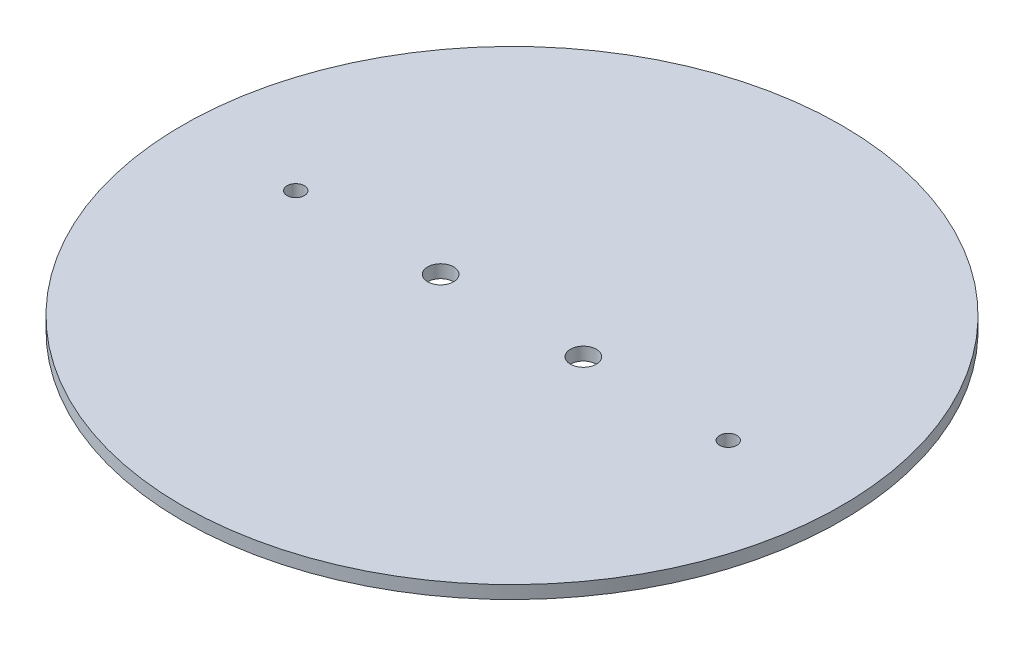
ISO-10303-21;
HEADER;
FILE_DESCRIPTION(('STEP AP214'),'2;1');
FILE_NAME('part.step','',(''),(''),'','','');
FILE_SCHEMA(('AUTOMOTIVE_DESIGN { 1 0 10303 214 1 1 1 1 }'));
ENDSEC;
DATA;
#1=APPLICATION_CONTEXT('core data for automotive mechanical design processes');
#2=APPLICATION_PROTOCOL_DEFINITION('international standard','automotive_design',2000,#1);
#3=PRODUCT_CONTEXT('',#1,'mechanical');
#4=PRODUCT('Part','Part','',(#3));
#5=PRODUCT_RELATED_PRODUCT_CATEGORY('part','',(#4));
#6=PRODUCT_DEFINITION_FORMATION('','',#4);
#7=PRODUCT_DEFINITION_CONTEXT('part definition',#1,'design');
#8=PRODUCT_DEFINITION('design','',#6,#7);
#9=PRODUCT_DEFINITION_SHAPE('','',#8);
#10=(LENGTH_UNIT() NAMED_UNIT(*) SI_UNIT(.MILLI.,.METRE.));
#11=(NAMED_UNIT(*) PLANE_ANGLE_UNIT() SI_UNIT($,.RADIAN.));
#12=(NAMED_UNIT(*) SI_UNIT($,.STERADIAN.) SOLID_ANGLE_UNIT());
#13=UNCERTAINTY_MEASURE_WITH_UNIT(LENGTH_MEASURE(1.E-05),#10,'distance_accuracy_value','');
#14=(GEOMETRIC_REPRESENTATION_CONTEXT(3) GLOBAL_UNCERTAINTY_ASSIGNED_CONTEXT((#13)) GLOBAL_UNIT_ASSIGNED_CONTEXT((#10,
#11,#12)) REPRESENTATION_CONTEXT('',''));
#15=CARTESIAN_POINT('',(0.,0.,0.));
#16=DIRECTION('',(0.,0.,1.));
#17=DIRECTION('',(1.,0.,0.));
#18=AXIS2_PLACEMENT_3D('',#15,#16,#17);
#19=CARTESIAN_POINT('',(0.,-1.5,0.));
#20=DIRECTION('',(0.,1.,0.));
#21=DIRECTION('',(0.,0.,1.));
#22=AXIS2_PLACEMENT_3D('',#19,#20,#21);
#23=CYLINDRICAL_SURFACE('',#22,76.2);
#24=CARTESIAN_POINT('',(0.,-1.5,0.));
#25=DIRECTION('',(0.,1.,0.));
#26=DIRECTION('',(0.,0.,1.));
#27=AXIS2_PLACEMENT_3D('',#24,#25,#26);
#28=CIRCLE('',#27,76.2);
#29=CARTESIAN_POINT('',(0.,-1.5,76.2));
#30=VERTEX_POINT('',#29);
#31=EDGE_CURVE('E10',#30,#30,#28,.T.);
#32=ORIENTED_EDGE('',*,*,#31,.T.);
#33=EDGE_LOOP('',(#32));
#34=FACE_BOUND('',#33,.T.);
#35=CARTESIAN_POINT('',(0.,1.5,0.));
#36=DIRECTION('',(0.,1.,0.));
#37=DIRECTION('',(0.,0.,1.));
#38=AXIS2_PLACEMENT_3D('',#35,#36,#37);
#39=CIRCLE('',#38,76.2);
#40=CARTESIAN_POINT('',(0.,1.5,76.2));
#41=VERTEX_POINT('',#40);
#42=EDGE_CURVE('E64',#41,#41,#39,.T.);
#43=ORIENTED_EDGE('',*,*,#42,.F.);
#44=EDGE_LOOP('',(#43));
#45=FACE_BOUND('',#44,.T.);
#46=ADVANCED_FACE('F37',(#34,#45),#23,.T.);
#47=CARTESIAN_POINT('',(0.,-1.5,0.));
#48=DIRECTION('',(0.,1.,0.));
#49=DIRECTION('',(0.,0.,1.));
#50=AXIS2_PLACEMENT_3D('',#47,#48,#49);
#51=PLANE('',#50);
#52=CARTESIAN_POINT('',(16.5,-1.5,0.));
#53=DIRECTION('',(0.,1.,0.));
#54=DIRECTION('',(0.,0.,1.));
#55=AXIS2_PLACEMENT_3D('',#52,#53,#54);
#56=CIRCLE('',#55,3.);
#57=CARTESIAN_POINT('',(16.5,-1.5,3.));
#58=VERTEX_POINT('',#57);
#59=EDGE_CURVE('E60',#58,#58,#56,.T.);
#60=ORIENTED_EDGE('',*,*,#59,.T.);
#61=EDGE_LOOP('',(#60));
#62=FACE_BOUND('',#61,.T.);
#63=CARTESIAN_POINT('',(-16.5,-1.5,0.));
#64=DIRECTION('',(0.,1.,0.));
#65=DIRECTION('',(0.,0.,1.));
#66=AXIS2_PLACEMENT_3D('',#63,#64,#65);
#67=CIRCLE('',#66,3.);
#68=CARTESIAN_POINT('',(-16.5,-1.5,3.));
#69=VERTEX_POINT('',#68);
#70=EDGE_CURVE('E54',#69,#69,#67,.T.);
#71=ORIENTED_EDGE('',*,*,#70,.T.);
#72=EDGE_LOOP('',(#71));
#73=FACE_BOUND('',#72,.T.);
#74=CARTESIAN_POINT('',(50.,-1.5,0.));
#75=DIRECTION('',(0.,1.,0.));
#76=DIRECTION('',(0.,0.,1.));
#77=AXIS2_PLACEMENT_3D('',#74,#75,#76);
#78=CIRCLE('',#77,2.);
#79=CARTESIAN_POINT('',(50.,-1.5,1.99999999999998));
#80=VERTEX_POINT('',#79);
#81=EDGE_CURVE('E49',#80,#80,#78,.T.);
#82=ORIENTED_EDGE('',*,*,#81,.T.);
#83=EDGE_LOOP('',(#82));
#84=FACE_BOUND('',#83,.T.);
#85=CARTESIAN_POINT('',(-50.,-1.5,0.));
#86=DIRECTION('',(0.,1.,0.));
#87=DIRECTION('',(0.,0.,1.));
#88=AXIS2_PLACEMENT_3D('',#85,#86,#87);
#89=CIRCLE('',#88,2.);
#90=CARTESIAN_POINT('',(-50.,-1.5,2.));
#91=VERTEX_POINT('',#90);
#92=EDGE_CURVE('E44',#91,#91,#89,.T.);
#93=ORIENTED_EDGE('',*,*,#92,.T.);
#94=EDGE_LOOP('',(#93));
#95=FACE_BOUND('',#94,.T.);
#96=ORIENTED_EDGE('',*,*,#31,.F.);
#97=EDGE_LOOP('',(#96));
#98=FACE_BOUND('',#97,.T.);
#99=ADVANCED_FACE('F100',(#62,#73,#84,#95,#98),#51,.F.);
#100=CARTESIAN_POINT('',(-50.,-1.5,0.));
#101=DIRECTION('',(0.,1.,0.));
#102=DIRECTION('',(0.,0.,1.));
#103=AXIS2_PLACEMENT_3D('',#100,#101,#102);
#104=CYLINDRICAL_SURFACE('',#103,2.);
#105=ORIENTED_EDGE('',*,*,#92,.F.);
#106=EDGE_LOOP('',(#105));
#107=FACE_BOUND('',#106,.T.);
#108=CARTESIAN_POINT('',(-50.,1.5,0.));
#109=DIRECTION('',(0.,1.,0.));
#110=DIRECTION('',(0.,0.,1.));
#111=AXIS2_PLACEMENT_3D('',#108,#109,#110);
#112=CIRCLE('',#111,2.);
#113=CARTESIAN_POINT('',(-50.,1.5,2.));
#114=VERTEX_POINT('',#113);
#115=EDGE_CURVE('E68',#114,#114,#112,.T.);
#116=ORIENTED_EDGE('',*,*,#115,.T.);
#117=EDGE_LOOP('',(#116));
#118=FACE_BOUND('',#117,.T.);
#119=ADVANCED_FACE('F104',(#107,#118),#104,.F.);
#120=CARTESIAN_POINT('',(50.,-1.5,0.));
#121=DIRECTION('',(0.,1.,0.));
#122=DIRECTION('',(0.,0.,1.));
#123=AXIS2_PLACEMENT_3D('',#120,#121,#122);
#124=CYLINDRICAL_SURFACE('',#123,2.);
#125=ORIENTED_EDGE('',*,*,#81,.F.);
#126=EDGE_LOOP('',(#125));
#127=FACE_BOUND('',#126,.T.);
#128=CARTESIAN_POINT('',(50.,1.5,0.));
#129=DIRECTION('',(0.,1.,0.));
#130=DIRECTION('',(0.,0.,1.));
#131=AXIS2_PLACEMENT_3D('',#128,#129,#130);
#132=CIRCLE('',#131,2.);
#133=CARTESIAN_POINT('',(50.,1.5,1.99999999999998));
#134=VERTEX_POINT('',#133);
#135=EDGE_CURVE('E72',#134,#134,#132,.T.);
#136=ORIENTED_EDGE('',*,*,#135,.T.);
#137=EDGE_LOOP('',(#136));
#138=FACE_BOUND('',#137,.T.);
#139=ADVANCED_FACE('F112',(#127,#138),#124,.F.);
#140=CARTESIAN_POINT('',(-16.5,-1.5,0.));
#141=DIRECTION('',(0.,1.,0.));
#142=DIRECTION('',(0.,0.,1.));
#143=AXIS2_PLACEMENT_3D('',#140,#141,#142);
#144=CYLINDRICAL_SURFACE('',#143,3.);
#145=ORIENTED_EDGE('',*,*,#70,.F.);
#146=EDGE_LOOP('',(#145));
#147=FACE_BOUND('',#146,.T.);
#148=CARTESIAN_POINT('',(-16.5,1.5,0.));
#149=DIRECTION('',(0.,1.,0.));
#150=DIRECTION('',(0.,0.,1.));
#151=AXIS2_PLACEMENT_3D('',#148,#149,#150);
#152=CIRCLE('',#151,3.);
#153=CARTESIAN_POINT('',(-16.5,1.5,3.));
#154=VERTEX_POINT('',#153);
#155=EDGE_CURVE('E76',#154,#154,#152,.T.);
#156=ORIENTED_EDGE('',*,*,#155,.T.);
#157=EDGE_LOOP('',(#156));
#158=FACE_BOUND('',#157,.T.);
#159=ADVANCED_FACE('F94',(#147,#158),#144,.F.);
#160=CARTESIAN_POINT('',(16.5,-1.5,0.));
#161=DIRECTION('',(0.,1.,0.));
#162=DIRECTION('',(0.,0.,1.));
#163=AXIS2_PLACEMENT_3D('',#160,#161,#162);
#164=CYLINDRICAL_SURFACE('',#163,3.);
#165=ORIENTED_EDGE('',*,*,#59,.F.);
#166=EDGE_LOOP('',(#165));
#167=FACE_BOUND('',#166,.T.);
#168=CARTESIAN_POINT('',(16.5,1.5,0.));
#169=DIRECTION('',(0.,1.,0.));
#170=DIRECTION('',(0.,0.,1.));
#171=AXIS2_PLACEMENT_3D('',#168,#169,#170);
#172=CIRCLE('',#171,3.);
#173=CARTESIAN_POINT('',(16.5,1.5,3.));
#174=VERTEX_POINT('',#173);
#175=EDGE_CURVE('E80',#174,#174,#172,.T.);
#176=ORIENTED_EDGE('',*,*,#175,.T.);
#177=EDGE_LOOP('',(#176));
#178=FACE_BOUND('',#177,.T.);
#179=ADVANCED_FACE('F85',(#167,#178),#164,.F.);
#180=CARTESIAN_POINT('',(0.,1.5,0.));
#181=DIRECTION('',(0.,1.,0.));
#182=DIRECTION('',(0.,0.,1.));
#183=AXIS2_PLACEMENT_3D('',#180,#181,#182);
#184=PLANE('',#183);
#185=ORIENTED_EDGE('',*,*,#155,.F.);
#186=EDGE_LOOP('',(#185));
#187=FACE_BOUND('',#186,.T.);
#188=ORIENTED_EDGE('',*,*,#115,.F.);
#189=EDGE_LOOP('',(#188));
#190=FACE_BOUND('',#189,.T.);
#191=ORIENTED_EDGE('',*,*,#42,.T.);
#192=EDGE_LOOP('',(#191));
#193=FACE_BOUND('',#192,.T.);
#194=ORIENTED_EDGE('',*,*,#135,.F.);
#195=EDGE_LOOP('',(#194));
#196=FACE_BOUND('',#195,.T.);
#197=ORIENTED_EDGE('',*,*,#175,.F.);
#198=EDGE_LOOP('',(#197));
#199=FACE_BOUND('',#198,.T.);
#200=ADVANCED_FACE('F87',(#187,#190,#193,#196,#199),#184,.T.);
#201=CLOSED_SHELL('',(#46,#99,#119,#139,#159,#179,#200));
#202=MANIFOLD_SOLID_BREP('B2',#201);
#203=ADVANCED_BREP_SHAPE_REPRESENTATION('',(#18,#202),#14);
#204=SHAPE_DEFINITION_REPRESENTATION(#9,#203);
ENDSEC;
END-ISO-10303-21;
